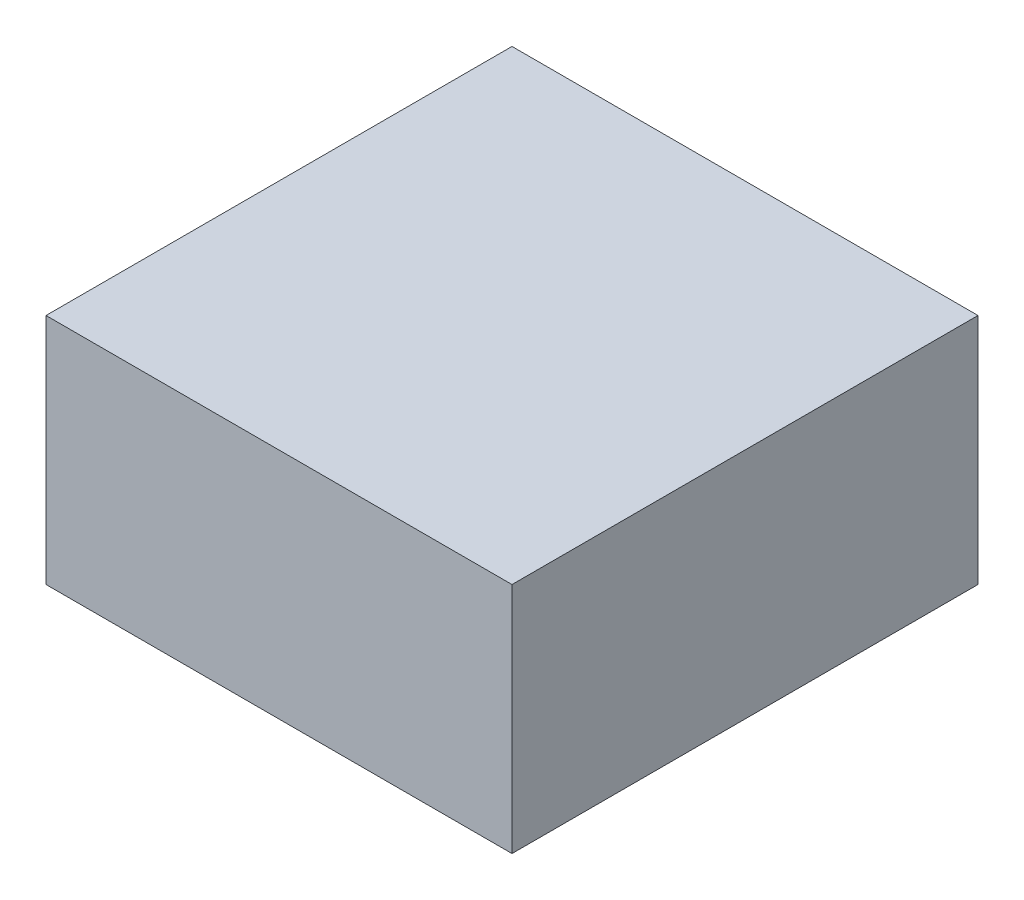
ISO-10303-21;
HEADER;
FILE_DESCRIPTION(('STEP AP214'),'2;1');
FILE_NAME('part.step','',(''),(''),'','','');
FILE_SCHEMA(('AUTOMOTIVE_DESIGN { 1 0 10303 214 1 1 1 1 }'));
ENDSEC;
DATA;
#1=APPLICATION_CONTEXT('core data for automotive mechanical design processes');
#2=APPLICATION_PROTOCOL_DEFINITION('international standard','automotive_design',2000,#1);
#3=PRODUCT_CONTEXT('',#1,'mechanical');
#4=PRODUCT('Part','Part','',(#3));
#5=PRODUCT_RELATED_PRODUCT_CATEGORY('part','',(#4));
#6=PRODUCT_DEFINITION_FORMATION('','',#4);
#7=PRODUCT_DEFINITION_CONTEXT('part definition',#1,'design');
#8=PRODUCT_DEFINITION('design','',#6,#7);
#9=PRODUCT_DEFINITION_SHAPE('','',#8);
#10=(LENGTH_UNIT() NAMED_UNIT(*) SI_UNIT(.MILLI.,.METRE.));
#11=(NAMED_UNIT(*) PLANE_ANGLE_UNIT() SI_UNIT($,.RADIAN.));
#12=(NAMED_UNIT(*) SI_UNIT($,.STERADIAN.) SOLID_ANGLE_UNIT());
#13=UNCERTAINTY_MEASURE_WITH_UNIT(LENGTH_MEASURE(1.E-05),#10,'distance_accuracy_value','');
#14=(GEOMETRIC_REPRESENTATION_CONTEXT(3) GLOBAL_UNCERTAINTY_ASSIGNED_CONTEXT((#13)) GLOBAL_UNIT_ASSIGNED_CONTEXT((#10,
#11,#12)) REPRESENTATION_CONTEXT('',''));
#15=CARTESIAN_POINT('',(0.,0.,0.));
#16=DIRECTION('',(0.,0.,1.));
#17=DIRECTION('',(1.,0.,0.));
#18=AXIS2_PLACEMENT_3D('',#15,#16,#17);
#19=CARTESIAN_POINT('',(28.,28.,28.));
#20=DIRECTION('',(-1.,0.,0.));
#21=DIRECTION('',(0.,0.,1.));
#22=AXIS2_PLACEMENT_3D('',#19,#20,#21);
#23=PLANE('',#22);
#24=DIRECTION('',(0.,0.,-1.));
#25=VECTOR('',#24,1.);
#26=CARTESIAN_POINT('',(28.,0.,28.));
#27=LINE('',#26,#25);
#28=CARTESIAN_POINT('',(28.,0.,28.));
#29=VERTEX_POINT('',#28);
#30=CARTESIAN_POINT('',(28.,0.,-28.));
#31=VERTEX_POINT('',#30);
#32=EDGE_CURVE('E101',#29,#31,#27,.T.);
#33=ORIENTED_EDGE('',*,*,#32,.T.);
#34=DIRECTION('',(0.,-1.,0.));
#35=VECTOR('',#34,1.);
#36=CARTESIAN_POINT('',(28.,28.,-28.));
#37=LINE('',#36,#35);
#38=CARTESIAN_POINT('',(28.,28.,-28.));
#39=VERTEX_POINT('',#38);
#40=EDGE_CURVE('E11',#39,#31,#37,.T.);
#41=ORIENTED_EDGE('',*,*,#40,.F.);
#42=DIRECTION('',(0.,0.,-1.));
#43=VECTOR('',#42,1.);
#44=CARTESIAN_POINT('',(28.,28.,28.));
#45=LINE('',#44,#43);
#46=CARTESIAN_POINT('',(28.,28.,28.));
#47=VERTEX_POINT('',#46);
#48=EDGE_CURVE('E89',#47,#39,#45,.T.);
#49=ORIENTED_EDGE('',*,*,#48,.F.);
#50=DIRECTION('',(0.,-1.,0.));
#51=VECTOR('',#50,1.);
#52=CARTESIAN_POINT('',(28.,28.,28.));
#53=LINE('',#52,#51);
#54=EDGE_CURVE('E97',#47,#29,#53,.T.);
#55=ORIENTED_EDGE('',*,*,#54,.T.);
#56=EDGE_LOOP('',(#33,#41,#49,#55));
#57=FACE_BOUND('',#56,.T.);
#58=ADVANCED_FACE('F38',(#57),#23,.F.);
#59=CARTESIAN_POINT('',(-28.,28.,-28.));
#60=DIRECTION('',(0.,0.,1.));
#61=DIRECTION('',(1.,0.,0.));
#62=AXIS2_PLACEMENT_3D('',#59,#60,#61);
#63=PLANE('',#62);
#64=DIRECTION('',(-1.,0.,0.));
#65=VECTOR('',#64,1.);
#66=CARTESIAN_POINT('',(-28.,0.,-28.));
#67=LINE('',#66,#65);
#68=CARTESIAN_POINT('',(-28.,0.,-28.));
#69=VERTEX_POINT('',#68);
#70=EDGE_CURVE('E93',#31,#69,#67,.T.);
#71=ORIENTED_EDGE('',*,*,#70,.T.);
#72=DIRECTION('',(0.,-1.,0.));
#73=VECTOR('',#72,1.);
#74=CARTESIAN_POINT('',(-28.,28.,-28.));
#75=LINE('',#74,#73);
#76=CARTESIAN_POINT('',(-28.,28.,-28.));
#77=VERTEX_POINT('',#76);
#78=EDGE_CURVE('E46',#77,#69,#75,.T.);
#79=ORIENTED_EDGE('',*,*,#78,.F.);
#80=DIRECTION('',(-1.,0.,0.));
#81=VECTOR('',#80,1.);
#82=CARTESIAN_POINT('',(-28.,28.,-28.));
#83=LINE('',#82,#81);
#84=EDGE_CURVE('E84',#39,#77,#83,.T.);
#85=ORIENTED_EDGE('',*,*,#84,.F.);
#86=ORIENTED_EDGE('',*,*,#40,.T.);
#87=EDGE_LOOP('',(#71,#79,#85,#86));
#88=FACE_BOUND('',#87,.T.);
#89=ADVANCED_FACE('F92',(#88),#63,.F.);
#90=CARTESIAN_POINT('',(-28.,28.,28.));
#91=DIRECTION('',(1.,0.,0.));
#92=DIRECTION('',(0.,0.,-1.));
#93=AXIS2_PLACEMENT_3D('',#90,#91,#92);
#94=PLANE('',#93);
#95=DIRECTION('',(0.,0.,1.));
#96=VECTOR('',#95,1.);
#97=CARTESIAN_POINT('',(-28.,0.,28.));
#98=LINE('',#97,#96);
#99=CARTESIAN_POINT('',(-28.,0.,28.));
#100=VERTEX_POINT('',#99);
#101=EDGE_CURVE('E71',#69,#100,#98,.T.);
#102=ORIENTED_EDGE('',*,*,#101,.T.);
#103=DIRECTION('',(0.,-1.,0.));
#104=VECTOR('',#103,1.);
#105=CARTESIAN_POINT('',(-28.,28.,28.));
#106=LINE('',#105,#104);
#107=CARTESIAN_POINT('',(-28.,28.,28.));
#108=VERTEX_POINT('',#107);
#109=EDGE_CURVE('E94',#108,#100,#106,.T.);
#110=ORIENTED_EDGE('',*,*,#109,.F.);
#111=DIRECTION('',(0.,0.,1.));
#112=VECTOR('',#111,1.);
#113=CARTESIAN_POINT('',(-28.,28.,28.));
#114=LINE('',#113,#112);
#115=EDGE_CURVE('E87',#77,#108,#114,.T.);
#116=ORIENTED_EDGE('',*,*,#115,.F.);
#117=ORIENTED_EDGE('',*,*,#78,.T.);
#118=EDGE_LOOP('',(#102,#110,#116,#117));
#119=FACE_BOUND('',#118,.T.);
#120=ADVANCED_FACE('F95',(#119),#94,.F.);
#121=CARTESIAN_POINT('',(-28.,28.,28.));
#122=DIRECTION('',(0.,0.,-1.));
#123=DIRECTION('',(-1.,0.,0.));
#124=AXIS2_PLACEMENT_3D('',#121,#122,#123);
#125=PLANE('',#124);
#126=DIRECTION('',(1.,0.,0.));
#127=VECTOR('',#126,1.);
#128=CARTESIAN_POINT('',(-28.,0.,28.));
#129=LINE('',#128,#127);
#130=EDGE_CURVE('E77',#100,#29,#129,.T.);
#131=ORIENTED_EDGE('',*,*,#130,.T.);
#132=ORIENTED_EDGE('',*,*,#54,.F.);
#133=DIRECTION('',(1.,0.,0.));
#134=VECTOR('',#133,1.);
#135=CARTESIAN_POINT('',(-28.,28.,28.));
#136=LINE('',#135,#134);
#137=EDGE_CURVE('E54',#108,#47,#136,.T.);
#138=ORIENTED_EDGE('',*,*,#137,.F.);
#139=ORIENTED_EDGE('',*,*,#109,.T.);
#140=EDGE_LOOP('',(#131,#132,#138,#139));
#141=FACE_BOUND('',#140,.T.);
#142=ADVANCED_FACE('F108',(#141),#125,.F.);
#143=CARTESIAN_POINT('',(0.,28.,0.));
#144=DIRECTION('',(0.,-1.,0.));
#145=DIRECTION('',(0.,0.,-1.));
#146=AXIS2_PLACEMENT_3D('',#143,#144,#145);
#147=PLANE('',#146);
#148=ORIENTED_EDGE('',*,*,#48,.T.);
#149=ORIENTED_EDGE('',*,*,#84,.T.);
#150=ORIENTED_EDGE('',*,*,#115,.T.);
#151=ORIENTED_EDGE('',*,*,#137,.T.);
#152=EDGE_LOOP('',(#148,#149,#150,#151));
#153=FACE_BOUND('',#152,.T.);
#154=ADVANCED_FACE('F85',(#153),#147,.F.);
#155=CARTESIAN_POINT('',(0.,0.,0.));
#156=DIRECTION('',(0.,-1.,0.));
#157=DIRECTION('',(0.,0.,-1.));
#158=AXIS2_PLACEMENT_3D('',#155,#156,#157);
#159=PLANE('',#158);
#160=ORIENTED_EDGE('',*,*,#32,.F.);
#161=ORIENTED_EDGE('',*,*,#130,.F.);
#162=ORIENTED_EDGE('',*,*,#101,.F.);
#163=ORIENTED_EDGE('',*,*,#70,.F.);
#164=EDGE_LOOP('',(#160,#161,#162,#163));
#165=FACE_BOUND('',#164,.T.);
#166=ADVANCED_FACE('F111',(#165),#159,.T.);
#167=CLOSED_SHELL('',(#58,#89,#120,#142,#154,#166));
#168=MANIFOLD_SOLID_BREP('B2',#167);
#169=ADVANCED_BREP_SHAPE_REPRESENTATION('',(#18,#168),#14);
#170=SHAPE_DEFINITION_REPRESENTATION(#9,#169);
ENDSEC;
END-ISO-10303-21;
